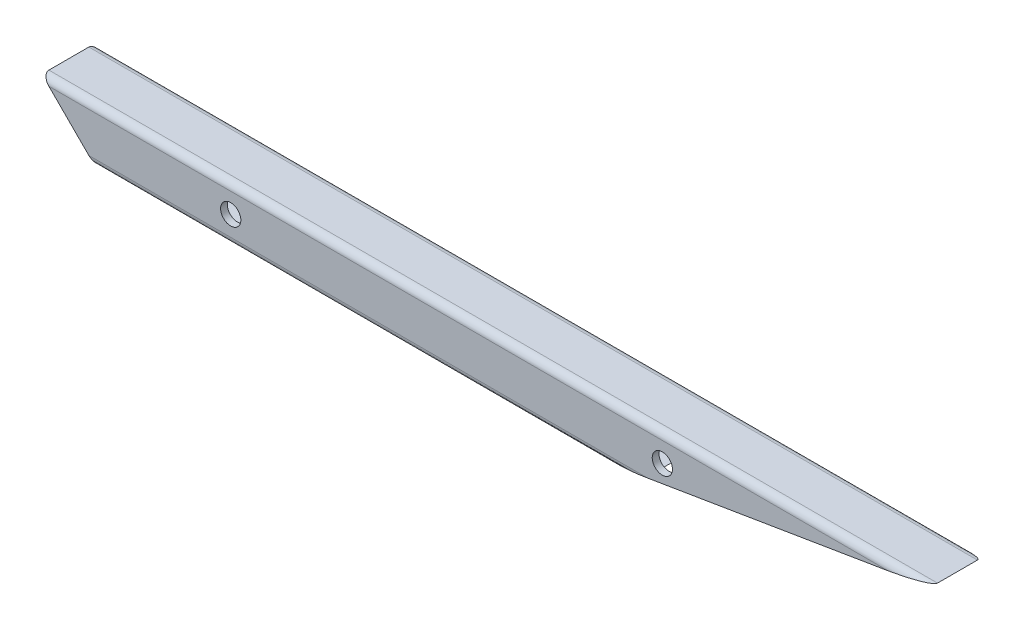
ISO-10303-21;
HEADER;
FILE_DESCRIPTION(('STEP AP214'),'2;1');
FILE_NAME('part.step','',(''),(''),'','','');
FILE_SCHEMA(('AUTOMOTIVE_DESIGN { 1 0 10303 214 1 1 1 1 }'));
ENDSEC;
DATA;
#1=APPLICATION_CONTEXT('core data for automotive mechanical design processes');
#2=APPLICATION_PROTOCOL_DEFINITION('international standard','automotive_design',2000,#1);
#3=PRODUCT_CONTEXT('',#1,'mechanical');
#4=PRODUCT('Part','Part','',(#3));
#5=PRODUCT_RELATED_PRODUCT_CATEGORY('part','',(#4));
#6=PRODUCT_DEFINITION_FORMATION('','',#4);
#7=PRODUCT_DEFINITION_CONTEXT('part definition',#1,'design');
#8=PRODUCT_DEFINITION('design','',#6,#7);
#9=PRODUCT_DEFINITION_SHAPE('','',#8);
#10=(LENGTH_UNIT() NAMED_UNIT(*) SI_UNIT(.MILLI.,.METRE.));
#11=(NAMED_UNIT(*) PLANE_ANGLE_UNIT() SI_UNIT($,.RADIAN.));
#12=(NAMED_UNIT(*) SI_UNIT($,.STERADIAN.) SOLID_ANGLE_UNIT());
#13=UNCERTAINTY_MEASURE_WITH_UNIT(LENGTH_MEASURE(1.E-05),#10,'distance_accuracy_value','');
#14=(GEOMETRIC_REPRESENTATION_CONTEXT(3) GLOBAL_UNCERTAINTY_ASSIGNED_CONTEXT((#13)) GLOBAL_UNIT_ASSIGNED_CONTEXT((#10,
#11,#12)) REPRESENTATION_CONTEXT('',''));
#15=CARTESIAN_POINT('',(0.,0.,0.));
#16=DIRECTION('',(0.,0.,1.));
#17=DIRECTION('',(1.,0.,0.));
#18=AXIS2_PLACEMENT_3D('',#15,#16,#17);
#19=CARTESIAN_POINT('',(418.338,6.22299999999999,-22.225));
#20=DIRECTION('',(0.,0.,1.));
#21=DIRECTION('',(1.,0.,0.));
#22=AXIS2_PLACEMENT_3D('',#19,#20,#21);
#23=PLANE('',#22);
#24=CARTESIAN_POINT('',(292.1,12.7,-22.225));
#25=DIRECTION('',(0.,0.,1.));
#26=DIRECTION('',(1.,0.,0.));
#27=AXIS2_PLACEMENT_3D('',#24,#25,#26);
#28=CIRCLE('',#27,4.76250000000001);
#29=CARTESIAN_POINT('',(296.8625,12.7,-22.225));
#30=VERTEX_POINT('',#29);
#31=EDGE_CURVE('E43',#30,#30,#28,.T.);
#32=ORIENTED_EDGE('',*,*,#31,.F.);
#33=EDGE_LOOP('',(#32));
#34=FACE_BOUND('',#33,.T.);
#35=DIRECTION('',(-0.707106781186548,0.707106781186548,0.));
#36=VECTOR('',#35,1.);
#37=CARTESIAN_POINT('',(218.7575,-193.3575,-22.225));
#38=LINE('',#37,#36);
#39=CARTESIAN_POINT('',(19.177,6.22299999999996,-22.225));
#40=VERTEX_POINT('',#39);
#41=CARTESIAN_POINT('',(6.22299999999992,19.177,-22.225));
#42=VERTEX_POINT('',#41);
#43=EDGE_CURVE('E11',#40,#42,#38,.T.);
#44=ORIENTED_EDGE('',*,*,#43,.F.);
#45=DIRECTION('',(-1.,0.,0.));
#46=VECTOR('',#45,1.);
#47=CARTESIAN_POINT('',(418.338,6.22299999999999,-22.225));
#48=LINE('',#47,#46);
#49=CARTESIAN_POINT('',(302.796575,6.22299999999999,-22.225));
#50=VERTEX_POINT('',#49);
#51=EDGE_CURVE('E212',#50,#40,#48,.T.);
#52=ORIENTED_EDGE('',*,*,#51,.F.);
#53=DIRECTION('',(-0.986504332347975,-0.16373515889593,0.));
#54=VECTOR('',#53,1.);
#55=CARTESIAN_POINT('',(415.240426567919,24.8858799282854,-22.225));
#56=LINE('',#55,#54);
#57=CARTESIAN_POINT('',(380.844425,19.177,-22.225));
#58=VERTEX_POINT('',#57);
#59=EDGE_CURVE('E48',#58,#50,#56,.T.);
#60=ORIENTED_EDGE('',*,*,#59,.F.);
#61=DIRECTION('',(-1.,0.,0.));
#62=VECTOR('',#61,1.);
#63=CARTESIAN_POINT('',(418.338,19.177,-22.225));
#64=LINE('',#63,#62);
#65=EDGE_CURVE('E219',#58,#42,#64,.T.);
#66=ORIENTED_EDGE('',*,*,#65,.T.);
#67=EDGE_LOOP('',(#44,#52,#60,#66));
#68=FACE_BOUND('',#67,.T.);
#69=CARTESIAN_POINT('',(88.9,12.7,-22.225));
#70=DIRECTION('',(0.,0.,1.));
#71=DIRECTION('',(1.,0.,0.));
#72=AXIS2_PLACEMENT_3D('',#69,#70,#71);
#73=CIRCLE('',#72,4.7625);
#74=CARTESIAN_POINT('',(93.6625,12.7,-22.225));
#75=VERTEX_POINT('',#74);
#76=EDGE_CURVE('E191',#75,#75,#73,.T.);
#77=ORIENTED_EDGE('',*,*,#76,.F.);
#78=EDGE_LOOP('',(#77));
#79=FACE_BOUND('',#78,.T.);
#80=ADVANCED_FACE('F39',(#34,#68,#79),#23,.T.);
#81=CARTESIAN_POINT('',(418.338,6.22299999999999,-19.177));
#82=DIRECTION('',(-1.,0.,0.));
#83=DIRECTION('',(0.,0.,1.));
#84=AXIS2_PLACEMENT_3D('',#81,#82,#83);
#85=CYLINDRICAL_SURFACE('',#84,3.048);
#86=CARTESIAN_POINT('',(19.1769999999999,6.22299999999999,-19.177));
#87=DIRECTION('',(0.707106781186548,0.707106781186548,0.));
#88=DIRECTION('',(-0.707106781186548,0.707106781186548,0.));
#89=AXIS2_PLACEMENT_3D('',#86,#87,#88);
#90=ELLIPSE('',#89,4.3105229381132,3.048);
#91=CARTESIAN_POINT('',(22.2249999999999,3.17499999999999,-19.177));
#92=VERTEX_POINT('',#91);
#93=EDGE_CURVE('E349',#92,#40,#90,.T.);
#94=ORIENTED_EDGE('',*,*,#93,.F.);
#95=DIRECTION('',(-1.,0.,0.));
#96=VECTOR('',#95,1.);
#97=CARTESIAN_POINT('',(418.338,3.17499999999999,-19.177));
#98=LINE('',#97,#96);
#99=CARTESIAN_POINT('',(284.432375,3.17499999999999,-19.177));
#100=VERTEX_POINT('',#99);
#101=EDGE_CURVE('E214',#100,#92,#98,.T.);
#102=ORIENTED_EDGE('',*,*,#101,.F.);
#103=CARTESIAN_POINT('',(302.796575,6.22299999999999,-19.177));
#104=DIRECTION('',(-0.16373515889593,0.986504332347975,0.));
#105=DIRECTION('',(-0.986504332347976,-0.16373515889593,0.));
#106=AXIS2_PLACEMENT_3D('',#103,#104,#105);
#107=ELLIPSE('',#106,18.6154276244195,3.048);
#108=EDGE_CURVE('E199',#50,#100,#107,.T.);
#109=ORIENTED_EDGE('',*,*,#108,.F.);
#110=ORIENTED_EDGE('',*,*,#51,.T.);
#111=EDGE_LOOP('',(#94,#102,#109,#110));
#112=FACE_BOUND('',#111,.T.);
#113=ADVANCED_FACE('F211',(#112),#85,.F.);
#114=CARTESIAN_POINT('',(418.338,3.17499999999999,-6.22300000000001));
#115=DIRECTION('',(0.,1.,0.));
#116=DIRECTION('',(0.,0.,1.));
#117=AXIS2_PLACEMENT_3D('',#114,#115,#116);
#118=PLANE('',#117);
#119=DIRECTION('',(0.,0.,-1.));
#120=VECTOR('',#119,1.);
#121=CARTESIAN_POINT('',(22.225,3.17499999999999,-6.22300000000001));
#122=LINE('',#121,#120);
#123=CARTESIAN_POINT('',(22.225,3.17499999999999,-6.22300000000001));
#124=VERTEX_POINT('',#123);
#125=EDGE_CURVE('E351',#124,#92,#122,.T.);
#126=ORIENTED_EDGE('',*,*,#125,.F.);
#127=DIRECTION('',(-1.,0.,0.));
#128=VECTOR('',#127,1.);
#129=CARTESIAN_POINT('',(418.338,3.175,-6.22300000000001));
#130=LINE('',#129,#128);
#131=CARTESIAN_POINT('',(284.432375,3.17499999999999,-6.22300000000001));
#132=VERTEX_POINT('',#131);
#133=EDGE_CURVE('E221',#132,#124,#130,.T.);
#134=ORIENTED_EDGE('',*,*,#133,.F.);
#135=DIRECTION('',(0.,0.,1.));
#136=VECTOR('',#135,1.);
#137=CARTESIAN_POINT('',(284.432375,3.17499999999999,-6.22300000000001));
#138=LINE('',#137,#136);
#139=EDGE_CURVE('E215',#100,#132,#138,.T.);
#140=ORIENTED_EDGE('',*,*,#139,.F.);
#141=ORIENTED_EDGE('',*,*,#101,.T.);
#142=EDGE_LOOP('',(#126,#134,#140,#141));
#143=FACE_BOUND('',#142,.T.);
#144=ADVANCED_FACE('F282',(#143),#118,.T.);
#145=CARTESIAN_POINT('',(418.338,6.22299999999999,-6.223));
#146=DIRECTION('',(-1.,0.,0.));
#147=DIRECTION('',(0.,0.,1.));
#148=AXIS2_PLACEMENT_3D('',#145,#146,#147);
#149=CYLINDRICAL_SURFACE('',#148,3.04799999999999);
#150=CARTESIAN_POINT('',(19.1769999999999,6.22299999999999,-6.223));
#151=DIRECTION('',(0.707106781186548,0.707106781186548,0.));
#152=DIRECTION('',(-0.707106781186548,0.707106781186548,0.));
#153=AXIS2_PLACEMENT_3D('',#150,#151,#152);
#154=ELLIPSE('',#153,4.31052293811319,3.04799999999999);
#155=CARTESIAN_POINT('',(19.1769999999999,6.22299999999999,-3.17500000000001));
#156=VERTEX_POINT('',#155);
#157=EDGE_CURVE('E357',#156,#124,#154,.T.);
#158=ORIENTED_EDGE('',*,*,#157,.F.);
#159=DIRECTION('',(-1.,0.,0.));
#160=VECTOR('',#159,1.);
#161=CARTESIAN_POINT('',(418.338,6.22299999999999,-3.17500000000001));
#162=LINE('',#161,#160);
#163=CARTESIAN_POINT('',(302.796575,6.22299999999999,-3.17500000000001));
#164=VERTEX_POINT('',#163);
#165=EDGE_CURVE('E229',#164,#156,#162,.T.);
#166=ORIENTED_EDGE('',*,*,#165,.F.);
#167=CARTESIAN_POINT('',(302.796575,6.22299999999999,-6.223));
#168=DIRECTION('',(-0.16373515889593,0.986504332347975,0.));
#169=DIRECTION('',(-0.986504332347976,-0.16373515889593,0.));
#170=AXIS2_PLACEMENT_3D('',#167,#168,#169);
#171=ELLIPSE('',#170,18.6154276244194,3.04799999999999);
#172=EDGE_CURVE('E382',#132,#164,#171,.T.);
#173=ORIENTED_EDGE('',*,*,#172,.F.);
#174=ORIENTED_EDGE('',*,*,#133,.T.);
#175=EDGE_LOOP('',(#158,#166,#173,#174));
#176=FACE_BOUND('',#175,.T.);
#177=ADVANCED_FACE('F290',(#176),#149,.F.);
#178=CARTESIAN_POINT('',(418.338,6.22299999999999,-3.17500000000001));
#179=DIRECTION('',(0.,0.,-1.));
#180=DIRECTION('',(-1.,0.,0.));
#181=AXIS2_PLACEMENT_3D('',#178,#179,#180);
#182=PLANE('',#181);
#183=CARTESIAN_POINT('',(292.1,12.7,-3.17500000000001));
#184=DIRECTION('',(0.,0.,-1.));
#185=DIRECTION('',(-1.,0.,0.));
#186=AXIS2_PLACEMENT_3D('',#183,#184,#185);
#187=CIRCLE('',#186,4.76250000000001);
#188=CARTESIAN_POINT('',(296.8625,12.7,-3.175));
#189=VERTEX_POINT('',#188);
#190=EDGE_CURVE('E223',#189,#189,#187,.T.);
#191=ORIENTED_EDGE('',*,*,#190,.F.);
#192=EDGE_LOOP('',(#191));
#193=FACE_BOUND('',#192,.T.);
#194=DIRECTION('',(0.707106781186548,-0.707106781186548,0.));
#195=VECTOR('',#194,1.);
#196=CARTESIAN_POINT('',(218.7575,-193.3575,-3.17500000000001));
#197=LINE('',#196,#195);
#198=CARTESIAN_POINT('',(6.22299999999992,19.177,-3.17500000000001));
#199=VERTEX_POINT('',#198);
#200=EDGE_CURVE('E359',#199,#156,#197,.T.);
#201=ORIENTED_EDGE('',*,*,#200,.F.);
#202=DIRECTION('',(-1.,0.,0.));
#203=VECTOR('',#202,1.);
#204=CARTESIAN_POINT('',(418.338,19.177,-3.175));
#205=LINE('',#204,#203);
#206=CARTESIAN_POINT('',(380.844425,19.177,-3.17500000000001));
#207=VERTEX_POINT('',#206);
#208=EDGE_CURVE('E232',#207,#199,#205,.T.);
#209=ORIENTED_EDGE('',*,*,#208,.F.);
#210=DIRECTION('',(0.986504332347975,0.16373515889593,0.));
#211=VECTOR('',#210,1.);
#212=CARTESIAN_POINT('',(415.240426567919,24.8858799282854,-3.17500000000001));
#213=LINE('',#212,#211);
#214=EDGE_CURVE('E377',#164,#207,#213,.T.);
#215=ORIENTED_EDGE('',*,*,#214,.F.);
#216=ORIENTED_EDGE('',*,*,#165,.T.);
#217=EDGE_LOOP('',(#201,#209,#215,#216));
#218=FACE_BOUND('',#217,.T.);
#219=CARTESIAN_POINT('',(88.9,12.7,-3.17500000000001));
#220=DIRECTION('',(0.,0.,-1.));
#221=DIRECTION('',(-1.,0.,0.));
#222=AXIS2_PLACEMENT_3D('',#219,#220,#221);
#223=CIRCLE('',#222,4.7625);
#224=CARTESIAN_POINT('',(93.6625,12.7,-3.175));
#225=VERTEX_POINT('',#224);
#226=EDGE_CURVE('E194',#225,#225,#223,.T.);
#227=ORIENTED_EDGE('',*,*,#226,.F.);
#228=EDGE_LOOP('',(#227));
#229=FACE_BOUND('',#228,.T.);
#230=ADVANCED_FACE('F294',(#193,#218,#229),#182,.T.);
#231=CARTESIAN_POINT('',(418.338,19.177,-6.223));
#232=DIRECTION('',(-1.,0.,0.));
#233=DIRECTION('',(0.,0.,1.));
#234=AXIS2_PLACEMENT_3D('',#231,#232,#233);
#235=CYLINDRICAL_SURFACE('',#234,3.04799999999999);
#236=CARTESIAN_POINT('',(6.22299999999998,19.177,-6.223));
#237=DIRECTION('',(0.707106781186548,0.707106781186548,0.));
#238=DIRECTION('',(-0.707106781186548,0.707106781186548,0.));
#239=AXIS2_PLACEMENT_3D('',#236,#237,#238);
#240=ELLIPSE('',#239,4.31052293811318,3.04799999999999);
#241=CARTESIAN_POINT('',(3.17499999999998,22.225,-6.22300000000001));
#242=VERTEX_POINT('',#241);
#243=EDGE_CURVE('E361',#242,#199,#240,.T.);
#244=ORIENTED_EDGE('',*,*,#243,.F.);
#245=DIRECTION('',(-1.,0.,0.));
#246=VECTOR('',#245,1.);
#247=CARTESIAN_POINT('',(418.338,22.225,-6.22300000000001));
#248=LINE('',#247,#246);
#249=CARTESIAN_POINT('',(399.208625,22.225,-6.22300000000001));
#250=VERTEX_POINT('',#249);
#251=EDGE_CURVE('E235',#250,#242,#248,.T.);
#252=ORIENTED_EDGE('',*,*,#251,.F.);
#253=CARTESIAN_POINT('',(380.844425,19.177,-6.223));
#254=DIRECTION('',(-0.16373515889593,0.986504332347975,0.));
#255=DIRECTION('',(-0.986504332347976,-0.16373515889593,0.));
#256=AXIS2_PLACEMENT_3D('',#253,#254,#255);
#257=ELLIPSE('',#256,18.6154276244194,3.04799999999999);
#258=EDGE_CURVE('E374',#207,#250,#257,.T.);
#259=ORIENTED_EDGE('',*,*,#258,.F.);
#260=ORIENTED_EDGE('',*,*,#208,.T.);
#261=EDGE_LOOP('',(#244,#252,#259,#260));
#262=FACE_BOUND('',#261,.T.);
#263=ADVANCED_FACE('F298',(#262),#235,.F.);
#264=CARTESIAN_POINT('',(418.338,22.225,-6.22300000000001));
#265=DIRECTION('',(0.,-1.,0.));
#266=DIRECTION('',(0.,0.,-1.));
#267=AXIS2_PLACEMENT_3D('',#264,#265,#266);
#268=PLANE('',#267);
#269=DIRECTION('',(0.,0.,1.));
#270=VECTOR('',#269,1.);
#271=CARTESIAN_POINT('',(3.17499999999998,22.225,-6.22300000000001));
#272=LINE('',#271,#270);
#273=CARTESIAN_POINT('',(3.17499999999998,22.225,-19.177));
#274=VERTEX_POINT('',#273);
#275=EDGE_CURVE('E262',#274,#242,#272,.T.);
#276=ORIENTED_EDGE('',*,*,#275,.F.);
#277=DIRECTION('',(-1.,0.,0.));
#278=VECTOR('',#277,1.);
#279=CARTESIAN_POINT('',(418.338,22.225,-19.177));
#280=LINE('',#279,#278);
#281=CARTESIAN_POINT('',(399.208625,22.225,-19.177));
#282=VERTEX_POINT('',#281);
#283=EDGE_CURVE('E238',#282,#274,#280,.T.);
#284=ORIENTED_EDGE('',*,*,#283,.F.);
#285=DIRECTION('',(0.,0.,-1.));
#286=VECTOR('',#285,1.);
#287=CARTESIAN_POINT('',(399.208625,22.225,-6.22300000000001));
#288=LINE('',#287,#286);
#289=EDGE_CURVE('E373',#250,#282,#288,.T.);
#290=ORIENTED_EDGE('',*,*,#289,.F.);
#291=ORIENTED_EDGE('',*,*,#251,.T.);
#292=EDGE_LOOP('',(#276,#284,#290,#291));
#293=FACE_BOUND('',#292,.T.);
#294=ADVANCED_FACE('F302',(#293),#268,.T.);
#295=CARTESIAN_POINT('',(418.338,19.177,-19.177));
#296=DIRECTION('',(-1.,0.,0.));
#297=DIRECTION('',(0.,0.,1.));
#298=AXIS2_PLACEMENT_3D('',#295,#296,#297);
#299=CYLINDRICAL_SURFACE('',#298,3.048);
#300=CARTESIAN_POINT('',(6.22299999999998,19.177,-19.177));
#301=DIRECTION('',(0.707106781186548,0.707106781186548,0.));
#302=DIRECTION('',(-0.707106781186548,0.707106781186548,0.));
#303=AXIS2_PLACEMENT_3D('',#300,#301,#302);
#304=ELLIPSE('',#303,4.3105229381132,3.048);
#305=EDGE_CURVE('E258',#42,#274,#304,.T.);
#306=ORIENTED_EDGE('',*,*,#305,.F.);
#307=ORIENTED_EDGE('',*,*,#65,.F.);
#308=CARTESIAN_POINT('',(380.844425,19.177,-19.177));
#309=DIRECTION('',(-0.16373515889593,0.986504332347975,0.));
#310=DIRECTION('',(-0.986504332347976,-0.16373515889593,0.));
#311=AXIS2_PLACEMENT_3D('',#308,#309,#310);
#312=ELLIPSE('',#311,18.6154276244195,3.048);
#313=EDGE_CURVE('E202',#282,#58,#312,.T.);
#314=ORIENTED_EDGE('',*,*,#313,.F.);
#315=ORIENTED_EDGE('',*,*,#283,.T.);
#316=EDGE_LOOP('',(#306,#307,#314,#315));
#317=FACE_BOUND('',#316,.T.);
#318=ADVANCED_FACE('F306',(#317),#299,.F.);
#319=CARTESIAN_POINT('',(88.9,12.7,-25.4));
#320=DIRECTION('',(0.,0.,1.));
#321=DIRECTION('',(1.,0.,0.));
#322=AXIS2_PLACEMENT_3D('',#319,#320,#321);
#323=CYLINDRICAL_SURFACE('',#322,4.7625);
#324=CARTESIAN_POINT('',(88.9,12.7,-25.4));
#325=DIRECTION('',(0.,0.,1.));
#326=DIRECTION('',(1.,0.,0.));
#327=AXIS2_PLACEMENT_3D('',#324,#325,#326);
#328=CIRCLE('',#327,4.7625);
#329=CARTESIAN_POINT('',(93.6625,12.7,-25.4));
#330=VERTEX_POINT('',#329);
#331=EDGE_CURVE('E195',#330,#330,#328,.T.);
#332=CARTESIAN_POINT('',(93.6625,12.7,-22.225));
#333=CARTESIAN_POINT('',(93.6625,12.7,-22.2580729166667));
#334=CARTESIAN_POINT('',(93.6625,12.7,-22.2911458333333));
#335=CARTESIAN_POINT('',(93.6625,12.7,-22.3572916666667));
#336=CARTESIAN_POINT('',(93.6625,12.7,-22.3903645833333));
#337=CARTESIAN_POINT('',(93.6625,12.7,-22.4565104166667));
#338=CARTESIAN_POINT('',(93.6625,12.7,-22.4895833333333));
#339=CARTESIAN_POINT('',(93.6625,12.7,-22.5557291666667));
#340=CARTESIAN_POINT('',(93.6625,12.7,-22.5888020833333));
#341=CARTESIAN_POINT('',(93.6625,12.7,-22.6549479166667));
#342=CARTESIAN_POINT('',(93.6625,12.7,-22.6880208333333));
#343=CARTESIAN_POINT('',(93.6625,12.7,-22.7541666666667));
#344=CARTESIAN_POINT('',(93.6625,12.7,-22.7872395833333));
#345=CARTESIAN_POINT('',(93.6625,12.7,-22.8533854166667));
#346=CARTESIAN_POINT('',(93.6625,12.7,-22.8864583333333));
#347=CARTESIAN_POINT('',(93.6625,12.7,-22.9526041666667));
#348=CARTESIAN_POINT('',(93.6625,12.7,-22.9856770833333));
#349=CARTESIAN_POINT('',(93.6625,12.7,-23.0518229166667));
#350=CARTESIAN_POINT('',(93.6625,12.7,-23.0848958333333));
#351=CARTESIAN_POINT('',(93.6625,12.7,-23.1510416666667));
#352=CARTESIAN_POINT('',(93.6625,12.7,-23.1841145833333));
#353=CARTESIAN_POINT('',(93.6625,12.7,-23.2502604166667));
#354=CARTESIAN_POINT('',(93.6625,12.7,-23.2833333333333));
#355=CARTESIAN_POINT('',(93.6625,12.7,-23.3494791666667));
#356=CARTESIAN_POINT('',(93.6625,12.7,-23.3825520833333));
#357=CARTESIAN_POINT('',(93.6625,12.7,-23.4486979166667));
#358=CARTESIAN_POINT('',(93.6625,12.7,-23.4817708333333));
#359=CARTESIAN_POINT('',(93.6625,12.7,-23.5479166666667));
#360=CARTESIAN_POINT('',(93.6625,12.7,-23.5809895833333));
#361=CARTESIAN_POINT('',(93.6625,12.7,-23.6471354166667));
#362=CARTESIAN_POINT('',(93.6625,12.7,-23.6802083333333));
#363=CARTESIAN_POINT('',(93.6625,12.7,-23.7463541666667));
#364=CARTESIAN_POINT('',(93.6625,12.7,-23.7794270833333));
#365=CARTESIAN_POINT('',(93.6625,12.7,-23.8455729166667));
#366=CARTESIAN_POINT('',(93.6625,12.7,-23.8786458333333));
#367=CARTESIAN_POINT('',(93.6625,12.7,-23.9447916666667));
#368=CARTESIAN_POINT('',(93.6625,12.7,-23.9778645833333));
#369=CARTESIAN_POINT('',(93.6625,12.7,-24.0440104166667));
#370=CARTESIAN_POINT('',(93.6625,12.7,-24.0770833333333));
#371=CARTESIAN_POINT('',(93.6625,12.7,-24.1432291666667));
#372=CARTESIAN_POINT('',(93.6625,12.7,-24.1763020833333));
#373=CARTESIAN_POINT('',(93.6625,12.7,-24.2424479166667));
#374=CARTESIAN_POINT('',(93.6625,12.7,-24.2755208333333));
#375=CARTESIAN_POINT('',(93.6625,12.7,-24.3416666666667));
#376=CARTESIAN_POINT('',(93.6625,12.7,-24.3747395833333));
#377=CARTESIAN_POINT('',(93.6625,12.7,-24.4408854166667));
#378=CARTESIAN_POINT('',(93.6625,12.7,-24.4739583333333));
#379=CARTESIAN_POINT('',(93.6625,12.7,-24.5401041666667));
#380=CARTESIAN_POINT('',(93.6625,12.7,-24.5731770833333));
#381=CARTESIAN_POINT('',(93.6625,12.7,-24.6393229166667));
#382=CARTESIAN_POINT('',(93.6625,12.7,-24.6723958333333));
#383=CARTESIAN_POINT('',(93.6625,12.7,-24.7385416666667));
#384=CARTESIAN_POINT('',(93.6625,12.7,-24.7716145833333));
#385=CARTESIAN_POINT('',(93.6625,12.7,-24.8377604166667));
#386=CARTESIAN_POINT('',(93.6625,12.7,-24.8708333333333));
#387=CARTESIAN_POINT('',(93.6625,12.7,-24.9369791666667));
#388=CARTESIAN_POINT('',(93.6625,12.7,-24.9700520833333));
#389=CARTESIAN_POINT('',(93.6625,12.7,-25.0361979166667));
#390=CARTESIAN_POINT('',(93.6625,12.7,-25.0692708333333));
#391=CARTESIAN_POINT('',(93.6625,12.7,-25.1354166666667));
#392=CARTESIAN_POINT('',(93.6625,12.7,-25.1684895833333));
#393=CARTESIAN_POINT('',(93.6625,12.7,-25.2346354166667));
#394=CARTESIAN_POINT('',(93.6625,12.7,-25.2677083333333));
#395=CARTESIAN_POINT('',(93.6625,12.7,-25.3338541666667));
#396=CARTESIAN_POINT('',(93.6625,12.7,-25.3669270833333));
#397=CARTESIAN_POINT('',(93.6625,12.7,-25.4));
#398=B_SPLINE_CURVE_WITH_KNOTS('',3,(#332,#333,#334,#335,#336,#337,#338,#339,#340,#341,#342,
#343,#344,#345,#346,#347,#348,#349,#350,#351,#352,#353,#354,#355,#356,#357,#358,#359,#360,#361,
#362,#363,#364,#365,#366,#367,#368,#369,#370,#371,#372,#373,#374,#375,#376,#377,#378,#379,#380,
#381,#382,#383,#384,#385,#386,#387,#388,#389,#390,#391,#392,#393,#394,#395,#396,#397),
.UNSPECIFIED.,.F.,.F.,(4,2,2,2,2,2,2,2,2,2,2,2,2,2,2,2,2,2,2,2,2,2,2,2,2,2,2,2,2,2,2,2,4),(0.,
0.0992187500000012,0.198437500000002,0.29765625,0.396875000000001,0.496093749999999,0.5953125,
0.694531250000002,0.793749999999999,0.892968750000001,0.992187500000002,1.09140625,1.190625,
1.28984375,1.3890625,1.48828125,1.5875,1.68671875,1.7859375,1.88515625,1.984375,2.08359375,
2.1828125,2.28203125,2.38125,2.48046875,2.5796875,2.67890625,2.778125,2.87734375,2.9765625,
3.07578125,3.175),.UNSPECIFIED.);
#399=EDGE_CURVE('BSEAM285',#75,#330,#398,.T.);
#400=ORIENTED_EDGE('',*,*,#76,.T.);
#401=ORIENTED_EDGE('',*,*,#331,.F.);
#402=ORIENTED_EDGE('',*,*,#399,.T.);
#403=ORIENTED_EDGE('',*,*,#399,.F.);
#404=EDGE_LOOP('',(#400,#402,#401,#403));
#405=FACE_BOUND('',#404,.T.);
#406=ADVANCED_FACE('F285',(#405),#323,.F.);
#407=CARTESIAN_POINT('',(265.303,0.,-25.4));
#408=DIRECTION('',(-0.16373515889593,0.986504332347975,0.));
#409=DIRECTION('',(-0.986504332347975,-0.16373515889593,0.));
#410=AXIS2_PLACEMENT_3D('',#407,#408,#409);
#411=PLANE('',#410);
#412=ORIENTED_EDGE('',*,*,#313,.T.);
#413=ORIENTED_EDGE('',*,*,#59,.T.);
#414=ORIENTED_EDGE('',*,*,#108,.T.);
#415=ORIENTED_EDGE('',*,*,#139,.T.);
#416=ORIENTED_EDGE('',*,*,#172,.T.);
#417=ORIENTED_EDGE('',*,*,#214,.T.);
#418=ORIENTED_EDGE('',*,*,#258,.T.);
#419=ORIENTED_EDGE('',*,*,#289,.T.);
#420=EDGE_LOOP('',(#412,#413,#414,#415,#416,#417,#418,#419));
#421=FACE_BOUND('',#420,.T.);
#422=DIRECTION('',(-0.986504332347975,-0.16373515889593,0.));
#423=VECTOR('',#422,1.);
#424=CARTESIAN_POINT('',(265.303,0.,-25.4));
#425=LINE('',#424,#423);
#426=CARTESIAN_POINT('',(398.44345,22.098,-25.4));
#427=VERTEX_POINT('',#426);
#428=CARTESIAN_POINT('',(285.19755,3.30199999999999,-25.4));
#429=VERTEX_POINT('',#428);
#430=EDGE_CURVE('E170',#427,#429,#425,.T.);
#431=ORIENTED_EDGE('',*,*,#430,.F.);
#432=CARTESIAN_POINT('',(398.44345,22.098,-22.098));
#433=DIRECTION('',(-0.16373515889593,0.986504332347975,0.));
#434=DIRECTION('',(-0.986504332347976,-0.16373515889593,0.));
#435=AXIS2_PLACEMENT_3D('',#432,#433,#434);
#436=ELLIPSE('',#435,20.1667132597878,3.302);
#437=CARTESIAN_POINT('',(418.338,25.4,-22.098));
#438=VERTEX_POINT('',#437);
#439=EDGE_CURVE('E160',#438,#427,#436,.T.);
#440=ORIENTED_EDGE('',*,*,#439,.F.);
#441=DIRECTION('',(0.,0.,1.));
#442=VECTOR('',#441,1.);
#443=CARTESIAN_POINT('',(418.338,25.4,-3.302));
#444=LINE('',#443,#442);
#445=CARTESIAN_POINT('',(418.338,25.4,-3.302));
#446=VERTEX_POINT('',#445);
#447=EDGE_CURVE('E155',#438,#446,#444,.T.);
#448=ORIENTED_EDGE('',*,*,#447,.T.);
#449=CARTESIAN_POINT('',(398.44345,22.098,-3.302));
#450=DIRECTION('',(-0.16373515889593,0.986504332347975,0.));
#451=DIRECTION('',(-0.986504332347976,-0.16373515889593,0.));
#452=AXIS2_PLACEMENT_3D('',#449,#450,#451);
#453=ELLIPSE('',#452,20.1667132597878,3.302);
#454=CARTESIAN_POINT('',(398.44345,22.098,0.));
#455=VERTEX_POINT('',#454);
#456=EDGE_CURVE('E150',#455,#446,#453,.T.);
#457=ORIENTED_EDGE('',*,*,#456,.F.);
#458=DIRECTION('',(-0.986504332347975,-0.16373515889593,0.));
#459=VECTOR('',#458,1.);
#460=CARTESIAN_POINT('',(265.303,0.,0.));
#461=LINE('',#460,#459);
#462=CARTESIAN_POINT('',(285.19755,3.30199999999999,0.));
#463=VERTEX_POINT('',#462);
#464=EDGE_CURVE('E153',#455,#463,#461,.T.);
#465=ORIENTED_EDGE('',*,*,#464,.T.);
#466=CARTESIAN_POINT('',(285.19755,3.302,-3.302));
#467=DIRECTION('',(-0.16373515889593,0.986504332347975,0.));
#468=DIRECTION('',(-0.986504332347976,-0.16373515889593,0.));
#469=AXIS2_PLACEMENT_3D('',#466,#467,#468);
#470=ELLIPSE('',#469,20.1667132597878,3.302);
#471=CARTESIAN_POINT('',(265.303,0.,-3.302));
#472=VERTEX_POINT('',#471);
#473=EDGE_CURVE('E55',#472,#463,#470,.T.);
#474=ORIENTED_EDGE('',*,*,#473,.F.);
#475=DIRECTION('',(0.,0.,1.));
#476=VECTOR('',#475,1.);
#477=CARTESIAN_POINT('',(265.303,0.,-25.4));
#478=LINE('',#477,#476);
#479=CARTESIAN_POINT('',(265.303,0.,-22.098));
#480=VERTEX_POINT('',#479);
#481=EDGE_CURVE('E253',#480,#472,#478,.T.);
#482=ORIENTED_EDGE('',*,*,#481,.F.);
#483=CARTESIAN_POINT('',(285.19755,3.302,-22.098));
#484=DIRECTION('',(-0.16373515889593,0.986504332347975,0.));
#485=DIRECTION('',(-0.986504332347976,-0.16373515889593,0.));
#486=AXIS2_PLACEMENT_3D('',#483,#484,#485);
#487=ELLIPSE('',#486,20.1667132597878,3.302);
#488=EDGE_CURVE('E348',#429,#480,#487,.T.);
#489=ORIENTED_EDGE('',*,*,#488,.F.);
#490=EDGE_LOOP('',(#431,#440,#448,#457,#465,#474,#482,#489));
#491=FACE_BOUND('',#490,.T.);
#492=ADVANCED_FACE('F152',(#421,#491),#411,.F.);
#493=CARTESIAN_POINT('',(0.,25.4,-25.4));
#494=DIRECTION('',(0.707106781186548,0.707106781186548,0.));
#495=DIRECTION('',(-0.707106781186548,0.707106781186548,0.));
#496=AXIS2_PLACEMENT_3D('',#493,#494,#495);
#497=PLANE('',#496);
#498=ORIENTED_EDGE('',*,*,#305,.T.);
#499=ORIENTED_EDGE('',*,*,#275,.T.);
#500=ORIENTED_EDGE('',*,*,#243,.T.);
#501=ORIENTED_EDGE('',*,*,#200,.T.);
#502=ORIENTED_EDGE('',*,*,#157,.T.);
#503=ORIENTED_EDGE('',*,*,#125,.T.);
#504=ORIENTED_EDGE('',*,*,#93,.T.);
#505=ORIENTED_EDGE('',*,*,#43,.T.);
#506=EDGE_LOOP('',(#498,#499,#500,#501,#502,#503,#504,#505));
#507=FACE_BOUND('',#506,.T.);
#508=DIRECTION('',(0.,0.,1.));
#509=VECTOR('',#508,1.);
#510=CARTESIAN_POINT('',(25.4,0.,-25.4));
#511=LINE('',#510,#509);
#512=CARTESIAN_POINT('',(25.4,0.,-22.098));
#513=VERTEX_POINT('',#512);
#514=CARTESIAN_POINT('',(25.4,0.,-3.30200000000001));
#515=VERTEX_POINT('',#514);
#516=EDGE_CURVE('E252',#513,#515,#511,.T.);
#517=ORIENTED_EDGE('',*,*,#516,.T.);
#518=CARTESIAN_POINT('',(22.0979999999999,3.302,-3.302));
#519=DIRECTION('',(0.707106781186548,0.707106781186548,0.));
#520=DIRECTION('',(-0.707106781186548,0.707106781186548,0.));
#521=AXIS2_PLACEMENT_3D('',#518,#519,#520);
#522=ELLIPSE('',#521,4.66973318295596,3.302);
#523=CARTESIAN_POINT('',(22.098,3.30199999999999,0.));
#524=VERTEX_POINT('',#523);
#525=EDGE_CURVE('E257',#524,#515,#522,.T.);
#526=ORIENTED_EDGE('',*,*,#525,.F.);
#527=DIRECTION('',(-0.707106781186547,0.707106781186547,0.));
#528=VECTOR('',#527,1.);
#529=CARTESIAN_POINT('',(0.,25.4,0.));
#530=LINE('',#529,#528);
#531=CARTESIAN_POINT('',(3.30200000000002,22.098,0.));
#532=VERTEX_POINT('',#531);
#533=EDGE_CURVE('E393',#524,#532,#530,.T.);
#534=ORIENTED_EDGE('',*,*,#533,.T.);
#535=CARTESIAN_POINT('',(3.30199999999997,22.098,-3.302));
#536=DIRECTION('',(0.707106781186548,0.707106781186548,0.));
#537=DIRECTION('',(-0.707106781186548,0.707106781186548,0.));
#538=AXIS2_PLACEMENT_3D('',#535,#536,#537);
#539=ELLIPSE('',#538,4.66973318295596,3.302);
#540=CARTESIAN_POINT('',(0.,25.4,-3.302));
#541=VERTEX_POINT('',#540);
#542=EDGE_CURVE('E174',#541,#532,#539,.T.);
#543=ORIENTED_EDGE('',*,*,#542,.F.);
#544=DIRECTION('',(0.,0.,1.));
#545=VECTOR('',#544,1.);
#546=CARTESIAN_POINT('',(0.,25.4,-3.302));
#547=LINE('',#546,#545);
#548=CARTESIAN_POINT('',(0.,25.4,-22.098));
#549=VERTEX_POINT('',#548);
#550=EDGE_CURVE('E241',#549,#541,#547,.T.);
#551=ORIENTED_EDGE('',*,*,#550,.F.);
#552=CARTESIAN_POINT('',(3.30199999999997,22.098,-22.098));
#553=DIRECTION('',(0.707106781186548,0.707106781186548,0.));
#554=DIRECTION('',(-0.707106781186548,0.707106781186548,0.));
#555=AXIS2_PLACEMENT_3D('',#552,#553,#554);
#556=ELLIPSE('',#555,4.66973318295596,3.302);
#557=CARTESIAN_POINT('',(3.30199999999998,22.098,-25.4));
#558=VERTEX_POINT('',#557);
#559=EDGE_CURVE('E260',#558,#549,#556,.T.);
#560=ORIENTED_EDGE('',*,*,#559,.F.);
#561=DIRECTION('',(-0.707106781186547,0.707106781186547,0.));
#562=VECTOR('',#561,1.);
#563=CARTESIAN_POINT('',(0.,25.4,-25.4));
#564=LINE('',#563,#562);
#565=CARTESIAN_POINT('',(22.098,3.30199999999999,-25.4));
#566=VERTEX_POINT('',#565);
#567=EDGE_CURVE('E346',#566,#558,#564,.T.);
#568=ORIENTED_EDGE('',*,*,#567,.F.);
#569=CARTESIAN_POINT('',(22.0979999999999,3.302,-22.098));
#570=DIRECTION('',(0.707106781186548,0.707106781186548,0.));
#571=DIRECTION('',(-0.707106781186548,0.707106781186548,0.));
#572=AXIS2_PLACEMENT_3D('',#569,#570,#571);
#573=ELLIPSE('',#572,4.66973318295596,3.302);
#574=EDGE_CURVE('E63',#513,#566,#573,.T.);
#575=ORIENTED_EDGE('',*,*,#574,.F.);
#576=EDGE_LOOP('',(#517,#526,#534,#543,#551,#560,#568,#575));
#577=FACE_BOUND('',#576,.T.);
#578=ADVANCED_FACE('F365',(#507,#577),#497,.F.);
#579=CARTESIAN_POINT('',(292.1,12.7,-25.4));
#580=DIRECTION('',(0.,0.,1.));
#581=DIRECTION('',(1.,0.,0.));
#582=AXIS2_PLACEMENT_3D('',#579,#580,#581);
#583=CYLINDRICAL_SURFACE('',#582,4.76250000000001);
#584=CARTESIAN_POINT('',(292.1,12.7,-25.4));
#585=DIRECTION('',(0.,0.,1.));
#586=DIRECTION('',(1.,0.,0.));
#587=AXIS2_PLACEMENT_3D('',#584,#585,#586);
#588=CIRCLE('',#587,4.76250000000001);
#589=CARTESIAN_POINT('',(296.8625,12.7,-25.4));
#590=VERTEX_POINT('',#589);
#591=EDGE_CURVE('E338',#590,#590,#588,.T.);
#592=CARTESIAN_POINT('',(296.8625,12.7,-22.225));
#593=CARTESIAN_POINT('',(296.8625,12.7,-22.2580729166667));
#594=CARTESIAN_POINT('',(296.8625,12.7,-22.2911458333333));
#595=CARTESIAN_POINT('',(296.8625,12.7,-22.3572916666667));
#596=CARTESIAN_POINT('',(296.8625,12.7,-22.3903645833333));
#597=CARTESIAN_POINT('',(296.8625,12.7,-22.4565104166667));
#598=CARTESIAN_POINT('',(296.8625,12.7,-22.4895833333333));
#599=CARTESIAN_POINT('',(296.8625,12.7,-22.5557291666667));
#600=CARTESIAN_POINT('',(296.8625,12.7,-22.5888020833333));
#601=CARTESIAN_POINT('',(296.8625,12.7,-22.6549479166667));
#602=CARTESIAN_POINT('',(296.8625,12.7,-22.6880208333333));
#603=CARTESIAN_POINT('',(296.8625,12.7,-22.7541666666667));
#604=CARTESIAN_POINT('',(296.8625,12.7,-22.7872395833333));
#605=CARTESIAN_POINT('',(296.8625,12.7,-22.8533854166667));
#606=CARTESIAN_POINT('',(296.8625,12.7,-22.8864583333333));
#607=CARTESIAN_POINT('',(296.8625,12.7,-22.9526041666667));
#608=CARTESIAN_POINT('',(296.8625,12.7,-22.9856770833333));
#609=CARTESIAN_POINT('',(296.8625,12.7,-23.0518229166667));
#610=CARTESIAN_POINT('',(296.8625,12.7,-23.0848958333333));
#611=CARTESIAN_POINT('',(296.8625,12.7,-23.1510416666667));
#612=CARTESIAN_POINT('',(296.8625,12.7,-23.1841145833333));
#613=CARTESIAN_POINT('',(296.8625,12.7,-23.2502604166667));
#614=CARTESIAN_POINT('',(296.8625,12.7,-23.2833333333333));
#615=CARTESIAN_POINT('',(296.8625,12.7,-23.3494791666667));
#616=CARTESIAN_POINT('',(296.8625,12.7,-23.3825520833333));
#617=CARTESIAN_POINT('',(296.8625,12.7,-23.4486979166667));
#618=CARTESIAN_POINT('',(296.8625,12.7,-23.4817708333333));
#619=CARTESIAN_POINT('',(296.8625,12.7,-23.5479166666667));
#620=CARTESIAN_POINT('',(296.8625,12.7,-23.5809895833333));
#621=CARTESIAN_POINT('',(296.8625,12.7,-23.6471354166667));
#622=CARTESIAN_POINT('',(296.8625,12.7,-23.6802083333333));
#623=CARTESIAN_POINT('',(296.8625,12.7,-23.7463541666667));
#624=CARTESIAN_POINT('',(296.8625,12.7,-23.7794270833333));
#625=CARTESIAN_POINT('',(296.8625,12.7,-23.8455729166667));
#626=CARTESIAN_POINT('',(296.8625,12.7,-23.8786458333333));
#627=CARTESIAN_POINT('',(296.8625,12.7,-23.9447916666667));
#628=CARTESIAN_POINT('',(296.8625,12.7,-23.9778645833333));
#629=CARTESIAN_POINT('',(296.8625,12.7,-24.0440104166667));
#630=CARTESIAN_POINT('',(296.8625,12.7,-24.0770833333333));
#631=CARTESIAN_POINT('',(296.8625,12.7,-24.1432291666667));
#632=CARTESIAN_POINT('',(296.8625,12.7,-24.1763020833333));
#633=CARTESIAN_POINT('',(296.8625,12.7,-24.2424479166667));
#634=CARTESIAN_POINT('',(296.8625,12.7,-24.2755208333333));
#635=CARTESIAN_POINT('',(296.8625,12.7,-24.3416666666667));
#636=CARTESIAN_POINT('',(296.8625,12.7,-24.3747395833333));
#637=CARTESIAN_POINT('',(296.8625,12.7,-24.4408854166667));
#638=CARTESIAN_POINT('',(296.8625,12.7,-24.4739583333333));
#639=CARTESIAN_POINT('',(296.8625,12.7,-24.5401041666667));
#640=CARTESIAN_POINT('',(296.8625,12.7,-24.5731770833333));
#641=CARTESIAN_POINT('',(296.8625,12.7,-24.6393229166667));
#642=CARTESIAN_POINT('',(296.8625,12.7,-24.6723958333333));
#643=CARTESIAN_POINT('',(296.8625,12.7,-24.7385416666667));
#644=CARTESIAN_POINT('',(296.8625,12.7,-24.7716145833333));
#645=CARTESIAN_POINT('',(296.8625,12.7,-24.8377604166667));
#646=CARTESIAN_POINT('',(296.8625,12.7,-24.8708333333333));
#647=CARTESIAN_POINT('',(296.8625,12.7,-24.9369791666667));
#648=CARTESIAN_POINT('',(296.8625,12.7,-24.9700520833333));
#649=CARTESIAN_POINT('',(296.8625,12.7,-25.0361979166667));
#650=CARTESIAN_POINT('',(296.8625,12.7,-25.0692708333333));
#651=CARTESIAN_POINT('',(296.8625,12.7,-25.1354166666667));
#652=CARTESIAN_POINT('',(296.8625,12.7,-25.1684895833333));
#653=CARTESIAN_POINT('',(296.8625,12.7,-25.2346354166667));
#654=CARTESIAN_POINT('',(296.8625,12.7,-25.2677083333333));
#655=CARTESIAN_POINT('',(296.8625,12.7,-25.3338541666667));
#656=CARTESIAN_POINT('',(296.8625,12.7,-25.3669270833333));
#657=CARTESIAN_POINT('',(296.8625,12.7,-25.4));
#658=B_SPLINE_CURVE_WITH_KNOTS('',3,(#592,#593,#594,#595,#596,#597,#598,#599,#600,#601,#602,
#603,#604,#605,#606,#607,#608,#609,#610,#611,#612,#613,#614,#615,#616,#617,#618,#619,#620,#621,
#622,#623,#624,#625,#626,#627,#628,#629,#630,#631,#632,#633,#634,#635,#636,#637,#638,#639,#640,
#641,#642,#643,#644,#645,#646,#647,#648,#649,#650,#651,#652,#653,#654,#655,#656,#657),
.UNSPECIFIED.,.F.,.F.,(4,2,2,2,2,2,2,2,2,2,2,2,2,2,2,2,2,2,2,2,2,2,2,2,2,2,2,2,2,2,2,2,4),(0.,
0.0992187500000012,0.198437500000002,0.29765625,0.396875000000001,0.496093749999999,0.5953125,
0.694531250000002,0.793749999999999,0.892968750000001,0.992187500000002,1.09140625,1.190625,
1.28984375,1.3890625,1.48828125,1.5875,1.68671875,1.7859375,1.88515625,1.984375,2.08359375,
2.1828125,2.28203125,2.38125,2.48046875,2.5796875,2.67890625,2.778125,2.87734375,2.9765625,
3.07578125,3.175),.UNSPECIFIED.);
#659=EDGE_CURVE('BSEAM274',#30,#590,#658,.T.);
#660=ORIENTED_EDGE('',*,*,#31,.T.);
#661=ORIENTED_EDGE('',*,*,#591,.F.);
#662=ORIENTED_EDGE('',*,*,#659,.T.);
#663=ORIENTED_EDGE('',*,*,#659,.F.);
#664=EDGE_LOOP('',(#660,#662,#661,#663));
#665=FACE_BOUND('',#664,.T.);
#666=ADVANCED_FACE('F274',(#665),#583,.F.);
#667=CARTESIAN_POINT('',(88.9,12.7,0.));
#668=DIRECTION('',(0.,0.,1.));
#669=DIRECTION('',(1.,0.,0.));
#670=AXIS2_PLACEMENT_3D('',#667,#668,#669);
#671=CIRCLE('',#670,4.7625);
#672=CARTESIAN_POINT('',(93.6625,12.7,0.));
#673=VERTEX_POINT('',#672);
#674=EDGE_CURVE('E387',#673,#673,#671,.T.);
#675=CARTESIAN_POINT('',(93.6625,12.7,-3.175));
#676=CARTESIAN_POINT('',(93.6625,12.7,-3.14192708333334));
#677=CARTESIAN_POINT('',(93.6625,12.7,-3.10885416666667));
#678=CARTESIAN_POINT('',(93.6625,12.7,-3.04270833333334));
#679=CARTESIAN_POINT('',(93.6625,12.7,-3.00963541666667));
#680=CARTESIAN_POINT('',(93.6625,12.7,-2.94348958333334));
#681=CARTESIAN_POINT('',(93.6625,12.7,-2.91041666666667));
#682=CARTESIAN_POINT('',(93.6625,12.7,-2.84427083333334));
#683=CARTESIAN_POINT('',(93.6625,12.7,-2.81119791666667));
#684=CARTESIAN_POINT('',(93.6625,12.7,-2.74505208333334));
#685=CARTESIAN_POINT('',(93.6625,12.7,-2.71197916666667));
#686=CARTESIAN_POINT('',(93.6625,12.7,-2.64583333333334));
#687=CARTESIAN_POINT('',(93.6625,12.7,-2.61276041666667));
#688=CARTESIAN_POINT('',(93.6625,12.7,-2.54661458333334));
#689=CARTESIAN_POINT('',(93.6625,12.7,-2.51354166666667));
#690=CARTESIAN_POINT('',(93.6625,12.7,-2.44739583333334));
#691=CARTESIAN_POINT('',(93.6625,12.7,-2.41432291666667));
#692=CARTESIAN_POINT('',(93.6625,12.7,-2.34817708333334));
#693=CARTESIAN_POINT('',(93.6625,12.7,-2.31510416666667));
#694=CARTESIAN_POINT('',(93.6625,12.7,-2.24895833333334));
#695=CARTESIAN_POINT('',(93.6625,12.7,-2.21588541666667));
#696=CARTESIAN_POINT('',(93.6625,12.7,-2.14973958333334));
#697=CARTESIAN_POINT('',(93.6625,12.7,-2.11666666666667));
#698=CARTESIAN_POINT('',(93.6625,12.7,-2.05052083333334));
#699=CARTESIAN_POINT('',(93.6625,12.7,-2.01744791666667));
#700=CARTESIAN_POINT('',(93.6625,12.7,-1.95130208333334));
#701=CARTESIAN_POINT('',(93.6625,12.7,-1.91822916666667));
#702=CARTESIAN_POINT('',(93.6625,12.7,-1.85208333333334));
#703=CARTESIAN_POINT('',(93.6625,12.7,-1.81901041666667));
#704=CARTESIAN_POINT('',(93.6625,12.7,-1.75286458333334));
#705=CARTESIAN_POINT('',(93.6625,12.7,-1.71979166666667));
#706=CARTESIAN_POINT('',(93.6625,12.7,-1.65364583333334));
#707=CARTESIAN_POINT('',(93.6625,12.7,-1.62057291666667));
#708=CARTESIAN_POINT('',(93.6625,12.7,-1.55442708333333));
#709=CARTESIAN_POINT('',(93.6625,12.7,-1.52135416666667));
#710=CARTESIAN_POINT('',(93.6625,12.7,-1.45520833333333));
#711=CARTESIAN_POINT('',(93.6625,12.7,-1.42213541666667));
#712=CARTESIAN_POINT('',(93.6625,12.7,-1.35598958333334));
#713=CARTESIAN_POINT('',(93.6625,12.7,-1.32291666666667));
#714=CARTESIAN_POINT('',(93.6625,12.7,-1.25677083333333));
#715=CARTESIAN_POINT('',(93.6625,12.7,-1.22369791666667));
#716=CARTESIAN_POINT('',(93.6625,12.7,-1.15755208333333));
#717=CARTESIAN_POINT('',(93.6625,12.7,-1.12447916666667));
#718=CARTESIAN_POINT('',(93.6625,12.7,-1.05833333333334));
#719=CARTESIAN_POINT('',(93.6625,12.7,-1.02526041666667));
#720=CARTESIAN_POINT('',(93.6625,12.7,-0.959114583333335));
#721=CARTESIAN_POINT('',(93.6625,12.7,-0.926041666666668));
#722=CARTESIAN_POINT('',(93.6625,12.7,-0.859895833333335));
#723=CARTESIAN_POINT('',(93.6625,12.7,-0.826822916666669));
#724=CARTESIAN_POINT('',(93.6625,12.7,-0.760677083333336));
#725=CARTESIAN_POINT('',(93.6625,12.7,-0.727604166666669));
#726=CARTESIAN_POINT('',(93.6625,12.7,-0.661458333333334));
#727=CARTESIAN_POINT('',(93.6625,12.7,-0.628385416666667));
#728=CARTESIAN_POINT('',(93.6625,12.7,-0.562239583333334));
#729=CARTESIAN_POINT('',(93.6625,12.7,-0.529166666666669));
#730=CARTESIAN_POINT('',(93.6625,12.7,-0.463020833333336));
#731=CARTESIAN_POINT('',(93.6625,12.7,-0.429947916666668));
#732=CARTESIAN_POINT('',(93.6625,12.7,-0.363802083333334));
#733=CARTESIAN_POINT('',(93.6625,12.7,-0.330729166666667));
#734=CARTESIAN_POINT('',(93.6625,12.7,-0.264583333333333));
#735=CARTESIAN_POINT('',(93.6625,12.7,-0.231510416666666));
#736=CARTESIAN_POINT('',(93.6625,12.7,-0.165364583333333));
#737=CARTESIAN_POINT('',(93.6625,12.7,-0.132291666666667));
#738=CARTESIAN_POINT('',(93.6625,12.7,-0.0661458333333341));
#739=CARTESIAN_POINT('',(93.6625,12.7,-0.0330729166666671));
#740=CARTESIAN_POINT('',(93.6625,12.7,0.));
#741=B_SPLINE_CURVE_WITH_KNOTS('',3,(#675,#676,#677,#678,#679,#680,#681,#682,#683,#684,#685,
#686,#687,#688,#689,#690,#691,#692,#693,#694,#695,#696,#697,#698,#699,#700,#701,#702,#703,#704,
#705,#706,#707,#708,#709,#710,#711,#712,#713,#714,#715,#716,#717,#718,#719,#720,#721,#722,#723,
#724,#725,#726,#727,#728,#729,#730,#731,#732,#733,#734,#735,#736,#737,#738,#739,#740),
.UNSPECIFIED.,.F.,.F.,(4,2,2,2,2,2,2,2,2,2,2,2,2,2,2,2,2,2,2,2,2,2,2,2,2,2,2,2,2,2,2,2,4),(0.,
0.0992187500000012,0.198437499999999,0.29765625,0.396875000000001,0.496093749999999,0.5953125,
0.694531250000002,0.793750000000003,0.892968750000001,0.992187500000002,1.09140625,1.190625,
1.28984375,1.3890625,1.48828125,1.5875,1.68671875,1.7859375,1.88515625,1.984375,2.08359375,
2.1828125,2.28203125,2.38125,2.48046875,2.5796875,2.67890625,2.778125,2.87734375,
2.97656250000001,3.07578125,3.175),.UNSPECIFIED.);
#742=EDGE_CURVE('BSEAM405',#225,#673,#741,.T.);
#743=ORIENTED_EDGE('',*,*,#226,.T.);
#744=ORIENTED_EDGE('',*,*,#674,.T.);
#745=ORIENTED_EDGE('',*,*,#742,.T.);
#746=ORIENTED_EDGE('',*,*,#742,.F.);
#747=EDGE_LOOP('',(#743,#745,#744,#746));
#748=FACE_BOUND('',#747,.T.);
#749=ADVANCED_FACE('F405',(#748),#323,.F.);
#750=CARTESIAN_POINT('',(292.1,12.7,0.));
#751=DIRECTION('',(0.,0.,1.));
#752=DIRECTION('',(1.,0.,0.));
#753=AXIS2_PLACEMENT_3D('',#750,#751,#752);
#754=CIRCLE('',#753,4.76250000000001);
#755=CARTESIAN_POINT('',(296.8625,12.7,0.));
#756=VERTEX_POINT('',#755);
#757=EDGE_CURVE('E392',#756,#756,#754,.T.);
#758=CARTESIAN_POINT('',(296.8625,12.7,-3.175));
#759=CARTESIAN_POINT('',(296.8625,12.7,-3.14192708333334));
#760=CARTESIAN_POINT('',(296.8625,12.7,-3.10885416666667));
#761=CARTESIAN_POINT('',(296.8625,12.7,-3.04270833333334));
#762=CARTESIAN_POINT('',(296.8625,12.7,-3.00963541666667));
#763=CARTESIAN_POINT('',(296.8625,12.7,-2.94348958333334));
#764=CARTESIAN_POINT('',(296.8625,12.7,-2.91041666666667));
#765=CARTESIAN_POINT('',(296.8625,12.7,-2.84427083333334));
#766=CARTESIAN_POINT('',(296.8625,12.7,-2.81119791666667));
#767=CARTESIAN_POINT('',(296.8625,12.7,-2.74505208333334));
#768=CARTESIAN_POINT('',(296.8625,12.7,-2.71197916666667));
#769=CARTESIAN_POINT('',(296.8625,12.7,-2.64583333333334));
#770=CARTESIAN_POINT('',(296.8625,12.7,-2.61276041666667));
#771=CARTESIAN_POINT('',(296.8625,12.7,-2.54661458333334));
#772=CARTESIAN_POINT('',(296.8625,12.7,-2.51354166666667));
#773=CARTESIAN_POINT('',(296.8625,12.7,-2.44739583333334));
#774=CARTESIAN_POINT('',(296.8625,12.7,-2.41432291666667));
#775=CARTESIAN_POINT('',(296.8625,12.7,-2.34817708333334));
#776=CARTESIAN_POINT('',(296.8625,12.7,-2.31510416666667));
#777=CARTESIAN_POINT('',(296.8625,12.7,-2.24895833333334));
#778=CARTESIAN_POINT('',(296.8625,12.7,-2.21588541666667));
#779=CARTESIAN_POINT('',(296.8625,12.7,-2.14973958333334));
#780=CARTESIAN_POINT('',(296.8625,12.7,-2.11666666666667));
#781=CARTESIAN_POINT('',(296.8625,12.7,-2.05052083333334));
#782=CARTESIAN_POINT('',(296.8625,12.7,-2.01744791666667));
#783=CARTESIAN_POINT('',(296.8625,12.7,-1.95130208333334));
#784=CARTESIAN_POINT('',(296.8625,12.7,-1.91822916666667));
#785=CARTESIAN_POINT('',(296.8625,12.7,-1.85208333333334));
#786=CARTESIAN_POINT('',(296.8625,12.7,-1.81901041666667));
#787=CARTESIAN_POINT('',(296.8625,12.7,-1.75286458333334));
#788=CARTESIAN_POINT('',(296.8625,12.7,-1.71979166666667));
#789=CARTESIAN_POINT('',(296.8625,12.7,-1.65364583333334));
#790=CARTESIAN_POINT('',(296.8625,12.7,-1.62057291666667));
#791=CARTESIAN_POINT('',(296.8625,12.7,-1.55442708333333));
#792=CARTESIAN_POINT('',(296.8625,12.7,-1.52135416666667));
#793=CARTESIAN_POINT('',(296.8625,12.7,-1.45520833333333));
#794=CARTESIAN_POINT('',(296.8625,12.7,-1.42213541666667));
#795=CARTESIAN_POINT('',(296.8625,12.7,-1.35598958333334));
#796=CARTESIAN_POINT('',(296.8625,12.7,-1.32291666666667));
#797=CARTESIAN_POINT('',(296.8625,12.7,-1.25677083333333));
#798=CARTESIAN_POINT('',(296.8625,12.7,-1.22369791666667));
#799=CARTESIAN_POINT('',(296.8625,12.7,-1.15755208333333));
#800=CARTESIAN_POINT('',(296.8625,12.7,-1.12447916666667));
#801=CARTESIAN_POINT('',(296.8625,12.7,-1.05833333333334));
#802=CARTESIAN_POINT('',(296.8625,12.7,-1.02526041666667));
#803=CARTESIAN_POINT('',(296.8625,12.7,-0.959114583333335));
#804=CARTESIAN_POINT('',(296.8625,12.7,-0.926041666666668));
#805=CARTESIAN_POINT('',(296.8625,12.7,-0.859895833333335));
#806=CARTESIAN_POINT('',(296.8625,12.7,-0.826822916666669));
#807=CARTESIAN_POINT('',(296.8625,12.7,-0.760677083333336));
#808=CARTESIAN_POINT('',(296.8625,12.7,-0.727604166666669));
#809=CARTESIAN_POINT('',(296.8625,12.7,-0.661458333333334));
#810=CARTESIAN_POINT('',(296.8625,12.7,-0.628385416666667));
#811=CARTESIAN_POINT('',(296.8625,12.7,-0.562239583333334));
#812=CARTESIAN_POINT('',(296.8625,12.7,-0.529166666666669));
#813=CARTESIAN_POINT('',(296.8625,12.7,-0.463020833333336));
#814=CARTESIAN_POINT('',(296.8625,12.7,-0.429947916666668));
#815=CARTESIAN_POINT('',(296.8625,12.7,-0.363802083333334));
#816=CARTESIAN_POINT('',(296.8625,12.7,-0.330729166666667));
#817=CARTESIAN_POINT('',(296.8625,12.7,-0.264583333333333));
#818=CARTESIAN_POINT('',(296.8625,12.7,-0.231510416666666));
#819=CARTESIAN_POINT('',(296.8625,12.7,-0.165364583333333));
#820=CARTESIAN_POINT('',(296.8625,12.7,-0.132291666666667));
#821=CARTESIAN_POINT('',(296.8625,12.7,-0.0661458333333341));
#822=CARTESIAN_POINT('',(296.8625,12.7,-0.0330729166666671));
#823=CARTESIAN_POINT('',(296.8625,12.7,0.));
#824=B_SPLINE_CURVE_WITH_KNOTS('',3,(#758,#759,#760,#761,#762,#763,#764,#765,#766,#767,#768,
#769,#770,#771,#772,#773,#774,#775,#776,#777,#778,#779,#780,#781,#782,#783,#784,#785,#786,#787,
#788,#789,#790,#791,#792,#793,#794,#795,#796,#797,#798,#799,#800,#801,#802,#803,#804,#805,#806,
#807,#808,#809,#810,#811,#812,#813,#814,#815,#816,#817,#818,#819,#820,#821,#822,#823),
.UNSPECIFIED.,.F.,.F.,(4,2,2,2,2,2,2,2,2,2,2,2,2,2,2,2,2,2,2,2,2,2,2,2,2,2,2,2,2,2,2,2,4),(0.,
0.0992187500000012,0.198437499999999,0.29765625,0.396875000000001,0.496093749999999,0.5953125,
0.694531250000002,0.793750000000003,0.892968750000001,0.992187500000002,1.09140625,1.190625,
1.28984375,1.3890625,1.48828125,1.5875,1.68671875,1.7859375,1.88515625,1.984375,2.08359375,
2.1828125,2.28203125,2.38125,2.48046875,2.5796875,2.67890625,2.778125,2.87734375,
2.97656250000001,3.07578125,3.175),.UNSPECIFIED.);
#825=EDGE_CURVE('BSEAM333',#189,#756,#824,.T.);
#826=ORIENTED_EDGE('',*,*,#190,.T.);
#827=ORIENTED_EDGE('',*,*,#757,.T.);
#828=ORIENTED_EDGE('',*,*,#825,.T.);
#829=ORIENTED_EDGE('',*,*,#825,.F.);
#830=EDGE_LOOP('',(#826,#828,#827,#829));
#831=FACE_BOUND('',#830,.T.);
#832=ADVANCED_FACE('F333',(#831),#583,.F.);
#833=CARTESIAN_POINT('',(418.338,3.302,-22.098));
#834=DIRECTION('',(-1.,0.,0.));
#835=DIRECTION('',(0.,0.,1.));
#836=AXIS2_PLACEMENT_3D('',#833,#834,#835);
#837=CYLINDRICAL_SURFACE('',#836,3.302);
#838=DIRECTION('',(-1.,0.,0.));
#839=VECTOR('',#838,1.);
#840=CARTESIAN_POINT('',(418.338,0.,-22.098));
#841=LINE('',#840,#839);
#842=EDGE_CURVE('E243',#480,#513,#841,.T.);
#843=ORIENTED_EDGE('',*,*,#842,.T.);
#844=ORIENTED_EDGE('',*,*,#574,.T.);
#845=DIRECTION('',(-1.,0.,0.));
#846=VECTOR('',#845,1.);
#847=CARTESIAN_POINT('',(418.338,3.302,-25.4));
#848=LINE('',#847,#846);
#849=EDGE_CURVE('E188',#429,#566,#848,.T.);
#850=ORIENTED_EDGE('',*,*,#849,.F.);
#851=ORIENTED_EDGE('',*,*,#488,.T.);
#852=EDGE_LOOP('',(#843,#844,#850,#851));
#853=FACE_BOUND('',#852,.T.);
#854=ADVANCED_FACE('F41',(#853),#837,.T.);
#855=CARTESIAN_POINT('',(418.338,3.302,-25.4));
#856=DIRECTION('',(0.,0.,1.));
#857=DIRECTION('',(1.,0.,0.));
#858=AXIS2_PLACEMENT_3D('',#855,#856,#857);
#859=PLANE('',#858);
#860=ORIENTED_EDGE('',*,*,#591,.T.);
#861=EDGE_LOOP('',(#860));
#862=FACE_BOUND('',#861,.T.);
#863=ORIENTED_EDGE('',*,*,#331,.T.);
#864=EDGE_LOOP('',(#863));
#865=FACE_BOUND('',#864,.T.);
#866=ORIENTED_EDGE('',*,*,#849,.T.);
#867=ORIENTED_EDGE('',*,*,#567,.T.);
#868=DIRECTION('',(-1.,0.,0.));
#869=VECTOR('',#868,1.);
#870=CARTESIAN_POINT('',(418.338,22.098,-25.4));
#871=LINE('',#870,#869);
#872=EDGE_CURVE('E185',#427,#558,#871,.T.);
#873=ORIENTED_EDGE('',*,*,#872,.F.);
#874=ORIENTED_EDGE('',*,*,#430,.T.);
#875=EDGE_LOOP('',(#866,#867,#873,#874));
#876=FACE_BOUND('',#875,.T.);
#877=ADVANCED_FACE('F326',(#862,#865,#876),#859,.F.);
#878=CARTESIAN_POINT('',(418.338,22.098,-22.098));
#879=DIRECTION('',(-1.,0.,0.));
#880=DIRECTION('',(0.,0.,1.));
#881=AXIS2_PLACEMENT_3D('',#878,#879,#880);
#882=CYLINDRICAL_SURFACE('',#881,3.302);
#883=ORIENTED_EDGE('',*,*,#872,.T.);
#884=ORIENTED_EDGE('',*,*,#559,.T.);
#885=DIRECTION('',(-1.,0.,0.));
#886=VECTOR('',#885,1.);
#887=CARTESIAN_POINT('',(418.338,25.4,-22.098));
#888=LINE('',#887,#886);
#889=EDGE_CURVE('E177',#438,#549,#888,.T.);
#890=ORIENTED_EDGE('',*,*,#889,.F.);
#891=ORIENTED_EDGE('',*,*,#439,.T.);
#892=EDGE_LOOP('',(#883,#884,#890,#891));
#893=FACE_BOUND('',#892,.T.);
#894=ADVANCED_FACE('F323',(#893),#882,.T.);
#895=CARTESIAN_POINT('',(418.338,25.4,-3.302));
#896=DIRECTION('',(0.,-1.,0.));
#897=DIRECTION('',(0.,0.,-1.));
#898=AXIS2_PLACEMENT_3D('',#895,#896,#897);
#899=PLANE('',#898);
#900=ORIENTED_EDGE('',*,*,#550,.T.);
#901=DIRECTION('',(-1.,0.,0.));
#902=VECTOR('',#901,1.);
#903=CARTESIAN_POINT('',(418.338,25.4,-3.302));
#904=LINE('',#903,#902);
#905=EDGE_CURVE('E175',#446,#541,#904,.T.);
#906=ORIENTED_EDGE('',*,*,#905,.F.);
#907=ORIENTED_EDGE('',*,*,#447,.F.);
#908=ORIENTED_EDGE('',*,*,#889,.T.);
#909=EDGE_LOOP('',(#900,#906,#907,#908));
#910=FACE_BOUND('',#909,.T.);
#911=ADVANCED_FACE('F320',(#910),#899,.F.);
#912=CARTESIAN_POINT('',(418.338,22.098,-3.302));
#913=DIRECTION('',(-1.,0.,0.));
#914=DIRECTION('',(0.,0.,1.));
#915=AXIS2_PLACEMENT_3D('',#912,#913,#914);
#916=CYLINDRICAL_SURFACE('',#915,3.302);
#917=ORIENTED_EDGE('',*,*,#905,.T.);
#918=ORIENTED_EDGE('',*,*,#542,.T.);
#919=DIRECTION('',(-1.,0.,0.));
#920=VECTOR('',#919,1.);
#921=CARTESIAN_POINT('',(418.338,22.098,0.));
#922=LINE('',#921,#920);
#923=EDGE_CURVE('E167',#455,#532,#922,.T.);
#924=ORIENTED_EDGE('',*,*,#923,.F.);
#925=ORIENTED_EDGE('',*,*,#456,.T.);
#926=EDGE_LOOP('',(#917,#918,#924,#925));
#927=FACE_BOUND('',#926,.T.);
#928=ADVANCED_FACE('F173',(#927),#916,.T.);
#929=CARTESIAN_POINT('',(418.338,3.302,0.));
#930=DIRECTION('',(0.,0.,-1.));
#931=DIRECTION('',(-1.,0.,0.));
#932=AXIS2_PLACEMENT_3D('',#929,#930,#931);
#933=PLANE('',#932);
#934=ORIENTED_EDGE('',*,*,#757,.F.);
#935=EDGE_LOOP('',(#934));
#936=FACE_BOUND('',#935,.T.);
#937=ORIENTED_EDGE('',*,*,#674,.F.);
#938=EDGE_LOOP('',(#937));
#939=FACE_BOUND('',#938,.T.);
#940=ORIENTED_EDGE('',*,*,#923,.T.);
#941=ORIENTED_EDGE('',*,*,#533,.F.);
#942=DIRECTION('',(-1.,0.,0.));
#943=VECTOR('',#942,1.);
#944=CARTESIAN_POINT('',(418.338,3.302,0.));
#945=LINE('',#944,#943);
#946=EDGE_CURVE('E169',#463,#524,#945,.T.);
#947=ORIENTED_EDGE('',*,*,#946,.F.);
#948=ORIENTED_EDGE('',*,*,#464,.F.);
#949=EDGE_LOOP('',(#940,#941,#947,#948));
#950=FACE_BOUND('',#949,.T.);
#951=ADVANCED_FACE('F165',(#936,#939,#950),#933,.F.);
#952=CARTESIAN_POINT('',(418.338,3.302,-3.302));
#953=DIRECTION('',(-1.,0.,0.));
#954=DIRECTION('',(0.,0.,1.));
#955=AXIS2_PLACEMENT_3D('',#952,#953,#954);
#956=CYLINDRICAL_SURFACE('',#955,3.302);
#957=ORIENTED_EDGE('',*,*,#946,.T.);
#958=ORIENTED_EDGE('',*,*,#525,.T.);
#959=DIRECTION('',(-1.,0.,0.));
#960=VECTOR('',#959,1.);
#961=CARTESIAN_POINT('',(418.338,0.,-3.302));
#962=LINE('',#961,#960);
#963=EDGE_CURVE('E179',#472,#515,#962,.T.);
#964=ORIENTED_EDGE('',*,*,#963,.F.);
#965=ORIENTED_EDGE('',*,*,#473,.T.);
#966=EDGE_LOOP('',(#957,#958,#964,#965));
#967=FACE_BOUND('',#966,.T.);
#968=ADVANCED_FACE('F256',(#967),#956,.T.);
#969=CARTESIAN_POINT('',(418.338,0.,-3.302));
#970=DIRECTION('',(0.,1.,0.));
#971=DIRECTION('',(0.,0.,1.));
#972=AXIS2_PLACEMENT_3D('',#969,#970,#971);
#973=PLANE('',#972);
#974=ORIENTED_EDGE('',*,*,#963,.T.);
#975=ORIENTED_EDGE('',*,*,#516,.F.);
#976=ORIENTED_EDGE('',*,*,#842,.F.);
#977=ORIENTED_EDGE('',*,*,#481,.T.);
#978=EDGE_LOOP('',(#974,#975,#976,#977));
#979=FACE_BOUND('',#978,.T.);
#980=ADVANCED_FACE('F250',(#979),#973,.F.);
#981=CLOSED_SHELL('',(#80,#113,#144,#177,#230,#263,#294,#318,#406,#492,#578,#666,#749,#832,#854,
#877,#894,#911,#928,#951,#968,#980));
#982=MANIFOLD_SOLID_BREP('B2',#981);
#983=ADVANCED_BREP_SHAPE_REPRESENTATION('',(#18,#982),#14);
#984=SHAPE_DEFINITION_REPRESENTATION(#9,#983);
ENDSEC;
END-ISO-10303-21;
